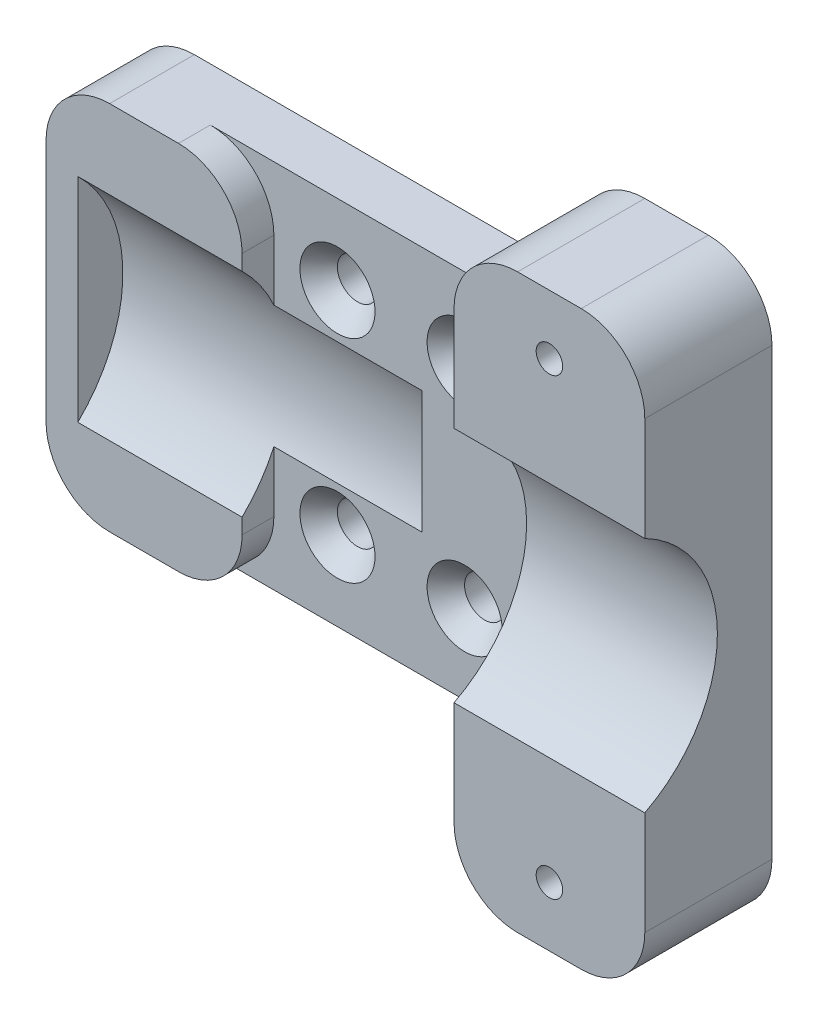
ISO-10303-21;
HEADER;
FILE_DESCRIPTION(('STEP AP214'),'2;1');
FILE_NAME('part.step','',(''),(''),'','','');
FILE_SCHEMA(('AUTOMOTIVE_DESIGN { 1 0 10303 214 1 1 1 1 }'));
ENDSEC;
DATA;
#1=APPLICATION_CONTEXT('core data for automotive mechanical design processes');
#2=APPLICATION_PROTOCOL_DEFINITION('international standard','automotive_design',2000,#1);
#3=PRODUCT_CONTEXT('',#1,'mechanical');
#4=PRODUCT('Part','Part','',(#3));
#5=PRODUCT_RELATED_PRODUCT_CATEGORY('part','',(#4));
#6=PRODUCT_DEFINITION_FORMATION('','',#4);
#7=PRODUCT_DEFINITION_CONTEXT('part definition',#1,'design');
#8=PRODUCT_DEFINITION('design','',#6,#7);
#9=PRODUCT_DEFINITION_SHAPE('','',#8);
#10=(LENGTH_UNIT() NAMED_UNIT(*) SI_UNIT(.MILLI.,.METRE.));
#11=(NAMED_UNIT(*) PLANE_ANGLE_UNIT() SI_UNIT($,.RADIAN.));
#12=(NAMED_UNIT(*) SI_UNIT($,.STERADIAN.) SOLID_ANGLE_UNIT());
#13=UNCERTAINTY_MEASURE_WITH_UNIT(LENGTH_MEASURE(1.E-05),#10,'distance_accuracy_value','');
#14=(GEOMETRIC_REPRESENTATION_CONTEXT(3) GLOBAL_UNCERTAINTY_ASSIGNED_CONTEXT((#13)) GLOBAL_UNIT_ASSIGNED_CONTEXT((#10,
#11,#12)) REPRESENTATION_CONTEXT('',''));
#15=CARTESIAN_POINT('',(0.,0.,0.));
#16=DIRECTION('',(0.,0.,1.));
#17=DIRECTION('',(1.,0.,0.));
#18=AXIS2_PLACEMENT_3D('',#15,#16,#17);
#19=CARTESIAN_POINT('',(-12.,17.5,12.));
#20=DIRECTION('',(-1.,0.,0.));
#21=DIRECTION('',(0.,0.,1.));
#22=AXIS2_PLACEMENT_3D('',#19,#20,#21);
#23=PLANE('',#22);
#24=DIRECTION('',(0.,1.,0.));
#25=VECTOR('',#24,1.);
#26=CARTESIAN_POINT('',(-12.,0.,5.));
#27=LINE('',#26,#25);
#28=CARTESIAN_POINT('',(-12.,5.78251675311019,5.));
#29=VERTEX_POINT('',#28);
#30=CARTESIAN_POINT('',(-12.,11.5,5.));
#31=VERTEX_POINT('',#30);
#32=EDGE_CURVE('E310',#29,#31,#27,.T.);
#33=ORIENTED_EDGE('',*,*,#32,.T.);
#34=DIRECTION('',(0.,0.,-1.));
#35=VECTOR('',#34,1.);
#36=CARTESIAN_POINT('',(-12.,11.5,12.));
#37=LINE('',#36,#35);
#38=CARTESIAN_POINT('',(-12.,11.5,8.));
#39=VERTEX_POINT('',#38);
#40=EDGE_CURVE('E394',#31,#39,#37,.F.);
#41=ORIENTED_EDGE('',*,*,#40,.T.);
#42=DIRECTION('',(0.,1.,0.));
#43=VECTOR('',#42,1.);
#44=CARTESIAN_POINT('',(-12.,17.5,8.));
#45=LINE('',#44,#43);
#46=CARTESIAN_POINT('',(-12.,10.0467656487051,8.));
#47=VERTEX_POINT('',#46);
#48=EDGE_CURVE('E306',#47,#39,#45,.T.);
#49=ORIENTED_EDGE('',*,*,#48,.F.);
#50=CARTESIAN_POINT('',(-12.,0.,17.75));
#51=DIRECTION('',(-1.,0.,0.));
#52=DIRECTION('',(0.,0.,1.));
#53=AXIS2_PLACEMENT_3D('',#50,#51,#52);
#54=CIRCLE('',#53,14.);
#55=EDGE_CURVE('E250',#47,#29,#54,.T.);
#56=ORIENTED_EDGE('',*,*,#55,.T.);
#57=EDGE_LOOP('',(#33,#41,#49,#56));
#58=FACE_BOUND('',#57,.T.);
#59=ADVANCED_FACE('F39',(#58),#23,.F.);
#60=CARTESIAN_POINT('',(0.,0.,12.));
#61=DIRECTION('',(0.,0.,1.));
#62=DIRECTION('',(1.,0.,0.));
#63=AXIS2_PLACEMENT_3D('',#60,#61,#62);
#64=PLANE('',#63);
#65=CARTESIAN_POINT('',(21.,-21.4,12.));
#66=DIRECTION('',(0.,0.,1.));
#67=DIRECTION('',(1.,0.,0.));
#68=AXIS2_PLACEMENT_3D('',#65,#66,#67);
#69=CIRCLE('',#68,1.25);
#70=CARTESIAN_POINT('',(22.25,-21.4,12.));
#71=VERTEX_POINT('',#70);
#72=EDGE_CURVE('E579',#71,#71,#69,.T.);
#73=ORIENTED_EDGE('',*,*,#72,.F.);
#74=EDGE_LOOP('',(#73));
#75=FACE_BOUND('',#74,.T.);
#76=DIRECTION('',(0.,-1.,0.));
#77=VECTOR('',#76,1.);
#78=CARTESIAN_POINT('',(12.,27.,12.));
#79=LINE('',#78,#77);
#80=CARTESIAN_POINT('',(12.,-11.2114896423267,12.));
#81=VERTEX_POINT('',#80);
#82=CARTESIAN_POINT('',(12.,-21.,12.));
#83=VERTEX_POINT('',#82);
#84=EDGE_CURVE('E223',#81,#83,#79,.T.);
#85=ORIENTED_EDGE('',*,*,#84,.T.);
#86=CARTESIAN_POINT('',(18.,-21.,12.));
#87=DIRECTION('',(0.,0.,1.));
#88=DIRECTION('',(1.,0.,0.));
#89=AXIS2_PLACEMENT_3D('',#86,#87,#88);
#90=CIRCLE('',#89,6.);
#91=CARTESIAN_POINT('',(18.,-27.,12.));
#92=VERTEX_POINT('',#91);
#93=EDGE_CURVE('E374',#83,#92,#90,.T.);
#94=ORIENTED_EDGE('',*,*,#93,.T.);
#95=DIRECTION('',(1.,0.,0.));
#96=VECTOR('',#95,1.);
#97=CARTESIAN_POINT('',(12.,-27.,12.));
#98=LINE('',#97,#96);
#99=CARTESIAN_POINT('',(24.,-27.,12.));
#100=VERTEX_POINT('',#99);
#101=EDGE_CURVE('E222',#92,#100,#98,.T.);
#102=ORIENTED_EDGE('',*,*,#101,.T.);
#103=CARTESIAN_POINT('',(24.,-21.,12.));
#104=DIRECTION('',(0.,0.,1.));
#105=DIRECTION('',(1.,0.,0.));
#106=AXIS2_PLACEMENT_3D('',#103,#104,#105);
#107=CIRCLE('',#106,6.);
#108=CARTESIAN_POINT('',(30.,-21.,12.));
#109=VERTEX_POINT('',#108);
#110=EDGE_CURVE('E372',#100,#109,#107,.T.);
#111=ORIENTED_EDGE('',*,*,#110,.T.);
#112=DIRECTION('',(0.,1.,0.));
#113=VECTOR('',#112,1.);
#114=CARTESIAN_POINT('',(30.,27.,12.));
#115=LINE('',#114,#113);
#116=CARTESIAN_POINT('',(30.,-11.2114896423267,12.));
#117=VERTEX_POINT('',#116);
#118=EDGE_CURVE('E296',#109,#117,#115,.T.);
#119=ORIENTED_EDGE('',*,*,#118,.T.);
#120=DIRECTION('',(1.,0.,0.));
#121=VECTOR('',#120,1.);
#122=CARTESIAN_POINT('',(44.5,-11.2114896423268,12.));
#123=LINE('',#122,#121);
#124=EDGE_CURVE('E232',#81,#117,#123,.T.);
#125=ORIENTED_EDGE('',*,*,#124,.F.);
#126=EDGE_LOOP('',(#85,#94,#102,#111,#119,#125));
#127=FACE_BOUND('',#126,.T.);
#128=ADVANCED_FACE('F468',(#75,#127),#64,.T.);
#129=CARTESIAN_POINT('',(0.,0.,5.));
#130=DIRECTION('',(0.,0.,-1.));
#131=DIRECTION('',(-1.,0.,0.));
#132=AXIS2_PLACEMENT_3D('',#129,#130,#131);
#133=PLANE('',#132);
#134=ORIENTED_EDGE('',*,*,#32,.F.);
#135=DIRECTION('',(1.,0.,0.));
#136=VECTOR('',#135,1.);
#137=CARTESIAN_POINT('',(44.5,5.78251675311022,5.));
#138=LINE('',#137,#136);
#139=CARTESIAN_POINT('',(2.,5.78251675311019,5.));
#140=VERTEX_POINT('',#139);
#141=EDGE_CURVE('E253',#29,#140,#138,.T.);
#142=ORIENTED_EDGE('',*,*,#141,.T.);
#143=DIRECTION('',(0.,-1.,0.));
#144=VECTOR('',#143,1.);
#145=CARTESIAN_POINT('',(2.,0.,5.));
#146=LINE('',#145,#144);
#147=CARTESIAN_POINT('',(2.,-5.78251675311019,5.));
#148=VERTEX_POINT('',#147);
#149=EDGE_CURVE('E326',#140,#148,#146,.T.);
#150=ORIENTED_EDGE('',*,*,#149,.T.);
#151=DIRECTION('',(1.,0.,0.));
#152=VECTOR('',#151,1.);
#153=CARTESIAN_POINT('',(44.5,-5.78251675311022,5.));
#154=LINE('',#153,#152);
#155=CARTESIAN_POINT('',(-12.,-5.78251675311019,5.));
#156=VERTEX_POINT('',#155);
#157=EDGE_CURVE('E249',#148,#156,#154,.F.);
#158=ORIENTED_EDGE('',*,*,#157,.T.);
#159=CARTESIAN_POINT('',(-12.,-11.5,5.));
#160=VERTEX_POINT('',#159);
#161=EDGE_CURVE('E307',#160,#156,#27,.T.);
#162=ORIENTED_EDGE('',*,*,#161,.F.);
#163=CARTESIAN_POINT('',(-18.,-11.5,5.));
#164=DIRECTION('',(0.,0.,-1.));
#165=DIRECTION('',(-1.,0.,0.));
#166=AXIS2_PLACEMENT_3D('',#163,#164,#165);
#167=CIRCLE('',#166,6.);
#168=CARTESIAN_POINT('',(-18.,-17.5,5.));
#169=VERTEX_POINT('',#168);
#170=EDGE_CURVE('E419',#160,#169,#167,.T.);
#171=ORIENTED_EDGE('',*,*,#170,.T.);
#172=DIRECTION('',(1.,0.,0.));
#173=VECTOR('',#172,1.);
#174=CARTESIAN_POINT('',(-30.5,-17.5,5.));
#175=LINE('',#174,#173);
#176=CARTESIAN_POINT('',(6.2633054056945,-17.5,5.));
#177=VERTEX_POINT('',#176);
#178=EDGE_CURVE('E233',#169,#177,#175,.T.);
#179=ORIENTED_EDGE('',*,*,#178,.T.);
#180=CARTESIAN_POINT('',(6.2633054056945,-23.5,5.));
#181=DIRECTION('',(0.,0.,-1.));
#182=DIRECTION('',(-1.,0.,0.));
#183=AXIS2_PLACEMENT_3D('',#180,#181,#182);
#184=CIRCLE('',#183,6.);
#185=CARTESIAN_POINT('',(12.1316527028473,-22.25,5.));
#186=VERTEX_POINT('',#185);
#187=EDGE_CURVE('E12',#177,#186,#184,.T.);
#188=ORIENTED_EDGE('',*,*,#187,.T.);
#189=CARTESIAN_POINT('',(18.,-21.,5.));
#190=DIRECTION('',(0.,0.,-1.));
#191=DIRECTION('',(-1.,0.,0.));
#192=AXIS2_PLACEMENT_3D('',#189,#190,#191);
#193=CIRCLE('',#192,6.);
#194=CARTESIAN_POINT('',(12.,-21.,5.));
#195=VERTEX_POINT('',#194);
#196=EDGE_CURVE('E430',#195,#186,#193,.F.);
#197=ORIENTED_EDGE('',*,*,#196,.F.);
#198=DIRECTION('',(0.,-1.,0.));
#199=VECTOR('',#198,1.);
#200=CARTESIAN_POINT('',(12.,0.,5.));
#201=LINE('',#200,#199);
#202=CARTESIAN_POINT('',(12.,21.,5.));
#203=VERTEX_POINT('',#202);
#204=EDGE_CURVE('E54',#203,#195,#201,.T.);
#205=ORIENTED_EDGE('',*,*,#204,.F.);
#206=CARTESIAN_POINT('',(18.,21.,5.));
#207=DIRECTION('',(0.,0.,-1.));
#208=DIRECTION('',(-1.,0.,0.));
#209=AXIS2_PLACEMENT_3D('',#206,#207,#208);
#210=CIRCLE('',#209,6.);
#211=CARTESIAN_POINT('',(12.1316527028473,22.25,5.));
#212=VERTEX_POINT('',#211);
#213=EDGE_CURVE('E422',#212,#203,#210,.F.);
#214=ORIENTED_EDGE('',*,*,#213,.F.);
#215=CARTESIAN_POINT('',(6.2633054056945,23.5,5.));
#216=DIRECTION('',(0.,0.,-1.));
#217=DIRECTION('',(-1.,0.,0.));
#218=AXIS2_PLACEMENT_3D('',#215,#216,#217);
#219=CIRCLE('',#218,6.);
#220=CARTESIAN_POINT('',(6.2633054056945,17.5,5.));
#221=VERTEX_POINT('',#220);
#222=EDGE_CURVE('E438',#212,#221,#219,.T.);
#223=ORIENTED_EDGE('',*,*,#222,.T.);
#224=DIRECTION('',(-1.,0.,0.));
#225=VECTOR('',#224,1.);
#226=CARTESIAN_POINT('',(-30.5,17.5,5.));
#227=LINE('',#226,#225);
#228=CARTESIAN_POINT('',(-18.,17.5,5.));
#229=VERTEX_POINT('',#228);
#230=EDGE_CURVE('E311',#221,#229,#227,.T.);
#231=ORIENTED_EDGE('',*,*,#230,.T.);
#232=CARTESIAN_POINT('',(-18.,11.5,5.));
#233=DIRECTION('',(0.,0.,-1.));
#234=DIRECTION('',(-1.,0.,0.));
#235=AXIS2_PLACEMENT_3D('',#232,#233,#234);
#236=CIRCLE('',#235,6.);
#237=EDGE_CURVE('E417',#229,#31,#236,.T.);
#238=ORIENTED_EDGE('',*,*,#237,.T.);
#239=EDGE_LOOP('',(#134,#142,#150,#158,#162,#171,#179,#188,#197,#205,#214,#223,#231,#238));
#240=FACE_BOUND('',#239,.T.);
#241=CARTESIAN_POINT('',(-6.,10.,5.));
#242=DIRECTION('',(0.,0.,1.));
#243=DIRECTION('',(1.,0.,0.));
#244=AXIS2_PLACEMENT_3D('',#241,#242,#243);
#245=CIRCLE('',#244,3.5433);
#246=CARTESIAN_POINT('',(-2.4567,10.,5.));
#247=VERTEX_POINT('',#246);
#248=EDGE_CURVE('E256',#247,#247,#245,.T.);
#249=ORIENTED_EDGE('',*,*,#248,.F.);
#250=EDGE_LOOP('',(#249));
#251=FACE_BOUND('',#250,.T.);
#252=CARTESIAN_POINT('',(6.,10.,5.));
#253=DIRECTION('',(0.,0.,1.));
#254=DIRECTION('',(1.,0.,0.));
#255=AXIS2_PLACEMENT_3D('',#252,#253,#254);
#256=CIRCLE('',#255,3.5433);
#257=CARTESIAN_POINT('',(9.5433,10.,5.));
#258=VERTEX_POINT('',#257);
#259=EDGE_CURVE('E265',#258,#258,#256,.T.);
#260=ORIENTED_EDGE('',*,*,#259,.F.);
#261=EDGE_LOOP('',(#260));
#262=FACE_BOUND('',#261,.T.);
#263=CARTESIAN_POINT('',(-6.,-10.,5.));
#264=DIRECTION('',(0.,0.,1.));
#265=DIRECTION('',(1.,0.,0.));
#266=AXIS2_PLACEMENT_3D('',#263,#264,#265);
#267=CIRCLE('',#266,3.5433);
#268=CARTESIAN_POINT('',(-2.4567,-10.,5.));
#269=VERTEX_POINT('',#268);
#270=EDGE_CURVE('E274',#269,#269,#267,.T.);
#271=ORIENTED_EDGE('',*,*,#270,.F.);
#272=EDGE_LOOP('',(#271));
#273=FACE_BOUND('',#272,.T.);
#274=CARTESIAN_POINT('',(6.,-10.,5.));
#275=DIRECTION('',(0.,0.,1.));
#276=DIRECTION('',(1.,0.,0.));
#277=AXIS2_PLACEMENT_3D('',#274,#275,#276);
#278=CIRCLE('',#277,3.5433);
#279=CARTESIAN_POINT('',(9.5433,-10.,5.));
#280=VERTEX_POINT('',#279);
#281=EDGE_CURVE('E283',#280,#280,#278,.T.);
#282=ORIENTED_EDGE('',*,*,#281,.F.);
#283=EDGE_LOOP('',(#282));
#284=FACE_BOUND('',#283,.T.);
#285=ADVANCED_FACE('F458',(#240,#251,#262,#273,#284),#133,.F.);
#286=CARTESIAN_POINT('',(-30.5,17.5,5.));
#287=DIRECTION('',(0.,-1.,0.));
#288=DIRECTION('',(0.,0.,-1.));
#289=AXIS2_PLACEMENT_3D('',#286,#287,#288);
#290=PLANE('',#289);
#291=ORIENTED_EDGE('',*,*,#230,.F.);
#292=DIRECTION('',(0.,0.,-1.));
#293=VECTOR('',#292,1.);
#294=CARTESIAN_POINT('',(6.2633054056945,17.5,5.));
#295=LINE('',#294,#293);
#296=CARTESIAN_POINT('',(6.2633054056945,17.5,0.));
#297=VERTEX_POINT('',#296);
#298=EDGE_CURVE('E428',#221,#297,#295,.T.);
#299=ORIENTED_EDGE('',*,*,#298,.T.);
#300=DIRECTION('',(-1.,0.,0.));
#301=VECTOR('',#300,1.);
#302=CARTESIAN_POINT('',(-30.5,17.5,0.));
#303=LINE('',#302,#301);
#304=CARTESIAN_POINT('',(-24.5,17.5,0.));
#305=VERTEX_POINT('',#304);
#306=EDGE_CURVE('E318',#297,#305,#303,.T.);
#307=ORIENTED_EDGE('',*,*,#306,.T.);
#308=DIRECTION('',(0.,0.,-1.));
#309=VECTOR('',#308,1.);
#310=CARTESIAN_POINT('',(-24.5,17.5,5.));
#311=LINE('',#310,#309);
#312=CARTESIAN_POINT('',(-24.5,17.5,8.));
#313=VERTEX_POINT('',#312);
#314=EDGE_CURVE('E389',#305,#313,#311,.F.);
#315=ORIENTED_EDGE('',*,*,#314,.T.);
#316=DIRECTION('',(-1.,0.,0.));
#317=VECTOR('',#316,1.);
#318=CARTESIAN_POINT('',(-12.,17.5,8.));
#319=LINE('',#318,#317);
#320=CARTESIAN_POINT('',(-18.,17.5,8.));
#321=VERTEX_POINT('',#320);
#322=EDGE_CURVE('E338',#321,#313,#319,.T.);
#323=ORIENTED_EDGE('',*,*,#322,.F.);
#324=DIRECTION('',(0.,0.,-1.));
#325=VECTOR('',#324,1.);
#326=CARTESIAN_POINT('',(-18.,17.5,5.));
#327=LINE('',#326,#325);
#328=EDGE_CURVE('E391',#321,#229,#327,.T.);
#329=ORIENTED_EDGE('',*,*,#328,.T.);
#330=EDGE_LOOP('',(#291,#299,#307,#315,#323,#329));
#331=FACE_BOUND('',#330,.T.);
#332=ADVANCED_FACE('F519',(#331),#290,.F.);
#333=CARTESIAN_POINT('',(-30.5,-17.5,5.));
#334=DIRECTION('',(0.,1.,0.));
#335=DIRECTION('',(0.,0.,1.));
#336=AXIS2_PLACEMENT_3D('',#333,#334,#335);
#337=PLANE('',#336);
#338=DIRECTION('',(1.,0.,0.));
#339=VECTOR('',#338,1.);
#340=CARTESIAN_POINT('',(-30.5,-17.5,0.));
#341=LINE('',#340,#339);
#342=CARTESIAN_POINT('',(-24.5,-17.5,0.));
#343=VERTEX_POINT('',#342);
#344=CARTESIAN_POINT('',(6.2633054056945,-17.5,0.));
#345=VERTEX_POINT('',#344);
#346=EDGE_CURVE('E313',#343,#345,#341,.T.);
#347=ORIENTED_EDGE('',*,*,#346,.T.);
#348=DIRECTION('',(0.,0.,-1.));
#349=VECTOR('',#348,1.);
#350=CARTESIAN_POINT('',(6.2633054056945,-17.5,5.));
#351=LINE('',#350,#349);
#352=EDGE_CURVE('E436',#345,#177,#351,.F.);
#353=ORIENTED_EDGE('',*,*,#352,.T.);
#354=ORIENTED_EDGE('',*,*,#178,.F.);
#355=DIRECTION('',(0.,0.,-1.));
#356=VECTOR('',#355,1.);
#357=CARTESIAN_POINT('',(-18.,-17.5,5.));
#358=LINE('',#357,#356);
#359=CARTESIAN_POINT('',(-18.,-17.5,8.));
#360=VERTEX_POINT('',#359);
#361=EDGE_CURVE('E410',#169,#360,#358,.F.);
#362=ORIENTED_EDGE('',*,*,#361,.T.);
#363=DIRECTION('',(1.,0.,0.));
#364=VECTOR('',#363,1.);
#365=CARTESIAN_POINT('',(-12.,-17.5,8.));
#366=LINE('',#365,#364);
#367=CARTESIAN_POINT('',(-24.5,-17.5,8.));
#368=VERTEX_POINT('',#367);
#369=EDGE_CURVE('E339',#368,#360,#366,.T.);
#370=ORIENTED_EDGE('',*,*,#369,.F.);
#371=DIRECTION('',(0.,0.,-1.));
#372=VECTOR('',#371,1.);
#373=CARTESIAN_POINT('',(-24.5,-17.5,5.));
#374=LINE('',#373,#372);
#375=EDGE_CURVE('E407',#368,#343,#374,.T.);
#376=ORIENTED_EDGE('',*,*,#375,.T.);
#377=EDGE_LOOP('',(#347,#353,#354,#362,#370,#376));
#378=FACE_BOUND('',#377,.T.);
#379=ADVANCED_FACE('F492',(#378),#337,.F.);
#380=CARTESIAN_POINT('',(30.,-17.5,5.));
#381=DIRECTION('',(-1.,0.,0.));
#382=DIRECTION('',(0.,0.,1.));
#383=AXIS2_PLACEMENT_3D('',#380,#381,#382);
#384=PLANE('',#383);
#385=DIRECTION('',(0.,1.,0.));
#386=VECTOR('',#385,1.);
#387=CARTESIAN_POINT('',(30.,-17.5,0.));
#388=LINE('',#387,#386);
#389=CARTESIAN_POINT('',(30.,-21.,0.));
#390=VERTEX_POINT('',#389);
#391=CARTESIAN_POINT('',(30.,21.,0.));
#392=VERTEX_POINT('',#391);
#393=EDGE_CURVE('E309',#390,#392,#388,.T.);
#394=ORIENTED_EDGE('',*,*,#393,.T.);
#395=DIRECTION('',(0.,0.,-1.));
#396=VECTOR('',#395,1.);
#397=CARTESIAN_POINT('',(30.,21.,5.));
#398=LINE('',#397,#396);
#399=CARTESIAN_POINT('',(30.,21.,12.));
#400=VERTEX_POINT('',#399);
#401=EDGE_CURVE('E387',#392,#400,#398,.F.);
#402=ORIENTED_EDGE('',*,*,#401,.T.);
#403=CARTESIAN_POINT('',(30.,11.2114896423267,12.));
#404=VERTEX_POINT('',#403);
#405=EDGE_CURVE('E295',#404,#400,#115,.T.);
#406=ORIENTED_EDGE('',*,*,#405,.F.);
#407=CARTESIAN_POINT('',(30.,0.,17.75));
#408=DIRECTION('',(-1.,0.,0.));
#409=DIRECTION('',(0.,0.,1.));
#410=AXIS2_PLACEMENT_3D('',#407,#408,#409);
#411=CIRCLE('',#410,12.6);
#412=EDGE_CURVE('E231',#404,#117,#411,.T.);
#413=ORIENTED_EDGE('',*,*,#412,.T.);
#414=ORIENTED_EDGE('',*,*,#118,.F.);
#415=DIRECTION('',(0.,0.,-1.));
#416=VECTOR('',#415,1.);
#417=CARTESIAN_POINT('',(30.,-21.,5.));
#418=LINE('',#417,#416);
#419=EDGE_CURVE('E384',#109,#390,#418,.T.);
#420=ORIENTED_EDGE('',*,*,#419,.T.);
#421=EDGE_LOOP('',(#394,#402,#406,#413,#414,#420));
#422=FACE_BOUND('',#421,.T.);
#423=ADVANCED_FACE('F472',(#422),#384,.F.);
#424=CARTESIAN_POINT('',(-30.5,17.5,5.));
#425=DIRECTION('',(1.,0.,0.));
#426=DIRECTION('',(0.,1.,0.));
#427=AXIS2_PLACEMENT_3D('',#424,#425,#426);
#428=PLANE('',#427);
#429=DIRECTION('',(0.,-1.,0.));
#430=VECTOR('',#429,1.);
#431=CARTESIAN_POINT('',(-30.5,17.5,8.));
#432=LINE('',#431,#430);
#433=CARTESIAN_POINT('',(-30.5,11.5,8.));
#434=VERTEX_POINT('',#433);
#435=CARTESIAN_POINT('',(-30.5,-11.5,8.));
#436=VERTEX_POINT('',#435);
#437=EDGE_CURVE('E342',#434,#436,#432,.T.);
#438=ORIENTED_EDGE('',*,*,#437,.F.);
#439=DIRECTION('',(0.,0.,-1.));
#440=VECTOR('',#439,1.);
#441=CARTESIAN_POINT('',(-30.5,11.5,5.));
#442=LINE('',#441,#440);
#443=CARTESIAN_POINT('',(-30.5,11.5,0.));
#444=VERTEX_POINT('',#443);
#445=EDGE_CURVE('E414',#434,#444,#442,.T.);
#446=ORIENTED_EDGE('',*,*,#445,.T.);
#447=DIRECTION('',(0.,-1.,0.));
#448=VECTOR('',#447,1.);
#449=CARTESIAN_POINT('',(-30.5,17.5,0.));
#450=LINE('',#449,#448);
#451=CARTESIAN_POINT('',(-30.5,-11.5,0.));
#452=VERTEX_POINT('',#451);
#453=EDGE_CURVE('E320',#444,#452,#450,.T.);
#454=ORIENTED_EDGE('',*,*,#453,.T.);
#455=DIRECTION('',(0.,0.,-1.));
#456=VECTOR('',#455,1.);
#457=CARTESIAN_POINT('',(-30.5,-11.5,5.));
#458=LINE('',#457,#456);
#459=EDGE_CURVE('E412',#452,#436,#458,.F.);
#460=ORIENTED_EDGE('',*,*,#459,.T.);
#461=EDGE_LOOP('',(#438,#446,#454,#460));
#462=FACE_BOUND('',#461,.T.);
#463=ADVANCED_FACE('F511',(#462),#428,.F.);
#464=CARTESIAN_POINT('',(0.,0.,0.));
#465=DIRECTION('',(0.,0.,-1.));
#466=DIRECTION('',(-1.,0.,0.));
#467=AXIS2_PLACEMENT_3D('',#464,#465,#466);
#468=PLANE('',#467);
#469=CARTESIAN_POINT('',(21.,21.4,0.));
#470=DIRECTION('',(0.,0.,-1.));
#471=DIRECTION('',(-1.,0.,0.));
#472=AXIS2_PLACEMENT_3D('',#469,#470,#471);
#473=CIRCLE('',#472,1.25);
#474=CARTESIAN_POINT('',(19.75,21.4,0.));
#475=VERTEX_POINT('',#474);
#476=EDGE_CURVE('E576',#475,#475,#473,.T.);
#477=ORIENTED_EDGE('',*,*,#476,.F.);
#478=EDGE_LOOP('',(#477));
#479=FACE_BOUND('',#478,.T.);
#480=CARTESIAN_POINT('',(21.,-21.4,0.));
#481=DIRECTION('',(0.,0.,-1.));
#482=DIRECTION('',(-1.,0.,0.));
#483=AXIS2_PLACEMENT_3D('',#480,#481,#482);
#484=CIRCLE('',#483,1.25);
#485=CARTESIAN_POINT('',(19.75,-21.4,0.));
#486=VERTEX_POINT('',#485);
#487=EDGE_CURVE('E584',#486,#486,#484,.T.);
#488=ORIENTED_EDGE('',*,*,#487,.F.);
#489=EDGE_LOOP('',(#488));
#490=FACE_BOUND('',#489,.T.);
#491=CARTESIAN_POINT('',(-6.,10.,0.));
#492=DIRECTION('',(0.,0.,1.));
#493=DIRECTION('',(1.,0.,0.));
#494=AXIS2_PLACEMENT_3D('',#491,#492,#493);
#495=CIRCLE('',#494,1.89865);
#496=CARTESIAN_POINT('',(-4.10135,10.,0.));
#497=VERTEX_POINT('',#496);
#498=EDGE_CURVE('E262',#497,#497,#495,.T.);
#499=ORIENTED_EDGE('',*,*,#498,.T.);
#500=EDGE_LOOP('',(#499));
#501=FACE_BOUND('',#500,.T.);
#502=CARTESIAN_POINT('',(6.,10.,0.));
#503=DIRECTION('',(0.,0.,1.));
#504=DIRECTION('',(1.,0.,0.));
#505=AXIS2_PLACEMENT_3D('',#502,#503,#504);
#506=CIRCLE('',#505,1.89865);
#507=CARTESIAN_POINT('',(7.89864999999999,10.,0.));
#508=VERTEX_POINT('',#507);
#509=EDGE_CURVE('E271',#508,#508,#506,.T.);
#510=ORIENTED_EDGE('',*,*,#509,.T.);
#511=EDGE_LOOP('',(#510));
#512=FACE_BOUND('',#511,.T.);
#513=CARTESIAN_POINT('',(-6.,-10.,0.));
#514=DIRECTION('',(0.,0.,1.));
#515=DIRECTION('',(1.,0.,0.));
#516=AXIS2_PLACEMENT_3D('',#513,#514,#515);
#517=CIRCLE('',#516,1.89865);
#518=CARTESIAN_POINT('',(-4.10135,-10.,0.));
#519=VERTEX_POINT('',#518);
#520=EDGE_CURVE('E280',#519,#519,#517,.T.);
#521=ORIENTED_EDGE('',*,*,#520,.T.);
#522=EDGE_LOOP('',(#521));
#523=FACE_BOUND('',#522,.T.);
#524=CARTESIAN_POINT('',(6.,-10.,0.));
#525=DIRECTION('',(0.,0.,1.));
#526=DIRECTION('',(1.,0.,0.));
#527=AXIS2_PLACEMENT_3D('',#524,#525,#526);
#528=CIRCLE('',#527,1.89865);
#529=CARTESIAN_POINT('',(7.89864999999999,-10.,0.));
#530=VERTEX_POINT('',#529);
#531=EDGE_CURVE('E289',#530,#530,#528,.T.);
#532=ORIENTED_EDGE('',*,*,#531,.T.);
#533=EDGE_LOOP('',(#532));
#534=FACE_BOUND('',#533,.T.);
#535=DIRECTION('',(1.,0.,0.));
#536=VECTOR('',#535,1.);
#537=CARTESIAN_POINT('',(12.,-27.,0.));
#538=LINE('',#537,#536);
#539=CARTESIAN_POINT('',(18.,-27.,0.));
#540=VERTEX_POINT('',#539);
#541=CARTESIAN_POINT('',(24.,-27.,0.));
#542=VERTEX_POINT('',#541);
#543=EDGE_CURVE('E291',#540,#542,#538,.T.);
#544=ORIENTED_EDGE('',*,*,#543,.F.);
#545=CARTESIAN_POINT('',(18.,-21.,0.));
#546=DIRECTION('',(0.,0.,-1.));
#547=DIRECTION('',(-1.,0.,0.));
#548=AXIS2_PLACEMENT_3D('',#545,#546,#547);
#549=CIRCLE('',#548,6.);
#550=CARTESIAN_POINT('',(12.1316527028473,-22.25,0.));
#551=VERTEX_POINT('',#550);
#552=EDGE_CURVE('E366',#540,#551,#549,.T.);
#553=ORIENTED_EDGE('',*,*,#552,.T.);
#554=CARTESIAN_POINT('',(6.2633054056945,-23.5,0.));
#555=DIRECTION('',(0.,0.,-1.));
#556=DIRECTION('',(-1.,0.,0.));
#557=AXIS2_PLACEMENT_3D('',#554,#555,#556);
#558=CIRCLE('',#557,6.);
#559=EDGE_CURVE('E47',#551,#345,#558,.F.);
#560=ORIENTED_EDGE('',*,*,#559,.T.);
#561=ORIENTED_EDGE('',*,*,#346,.F.);
#562=CARTESIAN_POINT('',(-24.5,-11.5,0.));
#563=DIRECTION('',(0.,0.,-1.));
#564=DIRECTION('',(-1.,0.,0.));
#565=AXIS2_PLACEMENT_3D('',#562,#563,#564);
#566=CIRCLE('',#565,6.);
#567=EDGE_CURVE('E355',#343,#452,#566,.T.);
#568=ORIENTED_EDGE('',*,*,#567,.T.);
#569=ORIENTED_EDGE('',*,*,#453,.F.);
#570=CARTESIAN_POINT('',(-24.5,11.5,0.));
#571=DIRECTION('',(0.,0.,-1.));
#572=DIRECTION('',(-1.,0.,0.));
#573=AXIS2_PLACEMENT_3D('',#570,#571,#572);
#574=CIRCLE('',#573,6.);
#575=EDGE_CURVE('E357',#444,#305,#574,.T.);
#576=ORIENTED_EDGE('',*,*,#575,.T.);
#577=ORIENTED_EDGE('',*,*,#306,.F.);
#578=CARTESIAN_POINT('',(6.2633054056945,23.5,0.));
#579=DIRECTION('',(0.,0.,-1.));
#580=DIRECTION('',(-1.,0.,0.));
#581=AXIS2_PLACEMENT_3D('',#578,#579,#580);
#582=CIRCLE('',#581,6.);
#583=CARTESIAN_POINT('',(12.1316527028473,22.25,0.));
#584=VERTEX_POINT('',#583);
#585=EDGE_CURVE('E440',#297,#584,#582,.F.);
#586=ORIENTED_EDGE('',*,*,#585,.T.);
#587=CARTESIAN_POINT('',(18.,21.,0.));
#588=DIRECTION('',(0.,0.,-1.));
#589=DIRECTION('',(-1.,0.,0.));
#590=AXIS2_PLACEMENT_3D('',#587,#588,#589);
#591=CIRCLE('',#590,6.);
#592=CARTESIAN_POINT('',(18.,27.,0.));
#593=VERTEX_POINT('',#592);
#594=EDGE_CURVE('E364',#584,#593,#591,.T.);
#595=ORIENTED_EDGE('',*,*,#594,.T.);
#596=DIRECTION('',(-1.,0.,0.));
#597=VECTOR('',#596,1.);
#598=CARTESIAN_POINT('',(12.,27.,0.));
#599=LINE('',#598,#597);
#600=CARTESIAN_POINT('',(24.,27.,0.));
#601=VERTEX_POINT('',#600);
#602=EDGE_CURVE('E302',#601,#593,#599,.T.);
#603=ORIENTED_EDGE('',*,*,#602,.F.);
#604=CARTESIAN_POINT('',(24.,21.,0.));
#605=DIRECTION('',(0.,0.,-1.));
#606=DIRECTION('',(-1.,0.,0.));
#607=AXIS2_PLACEMENT_3D('',#604,#605,#606);
#608=CIRCLE('',#607,6.);
#609=EDGE_CURVE('E362',#601,#392,#608,.T.);
#610=ORIENTED_EDGE('',*,*,#609,.T.);
#611=ORIENTED_EDGE('',*,*,#393,.F.);
#612=CARTESIAN_POINT('',(24.,-21.,0.));
#613=DIRECTION('',(0.,0.,-1.));
#614=DIRECTION('',(-1.,0.,0.));
#615=AXIS2_PLACEMENT_3D('',#612,#613,#614);
#616=CIRCLE('',#615,6.);
#617=EDGE_CURVE('E360',#390,#542,#616,.T.);
#618=ORIENTED_EDGE('',*,*,#617,.T.);
#619=EDGE_LOOP('',(#544,#553,#560,#561,#568,#569,#576,#577,#586,#595,#603,#610,#611,#618));
#620=FACE_BOUND('',#619,.T.);
#621=ADVANCED_FACE('F445',(#479,#490,#501,#512,#523,#534,#620),#468,.T.);
#622=DIRECTION('',(0.,1.,0.));
#623=VECTOR('',#622,1.);
#624=CARTESIAN_POINT('',(-12.,17.5,8.));
#625=LINE('',#624,#623);
#626=CARTESIAN_POINT('',(-12.,-11.5,8.));
#627=VERTEX_POINT('',#626);
#628=CARTESIAN_POINT('',(-12.,-10.0467656487051,8.));
#629=VERTEX_POINT('',#628);
#630=EDGE_CURVE('E336',#627,#629,#625,.T.);
#631=ORIENTED_EDGE('',*,*,#630,.F.);
#632=DIRECTION('',(0.,0.,-1.));
#633=VECTOR('',#632,1.);
#634=CARTESIAN_POINT('',(-12.,-11.5,12.));
#635=LINE('',#634,#633);
#636=EDGE_CURVE('E404',#627,#160,#635,.T.);
#637=ORIENTED_EDGE('',*,*,#636,.T.);
#638=ORIENTED_EDGE('',*,*,#161,.T.);
#639=EDGE_CURVE('E240',#156,#629,#54,.T.);
#640=ORIENTED_EDGE('',*,*,#639,.T.);
#641=EDGE_LOOP('',(#631,#637,#638,#640));
#642=FACE_BOUND('',#641,.T.);
#643=ADVANCED_FACE('F539',(#642),#23,.F.);
#644=CARTESIAN_POINT('',(0.,0.,8.));
#645=DIRECTION('',(0.,0.,-1.));
#646=DIRECTION('',(-1.,0.,0.));
#647=AXIS2_PLACEMENT_3D('',#644,#645,#646);
#648=PLANE('',#647);
#649=ORIENTED_EDGE('',*,*,#48,.T.);
#650=CARTESIAN_POINT('',(-18.,11.5,8.));
#651=DIRECTION('',(0.,0.,-1.));
#652=DIRECTION('',(-1.,0.,0.));
#653=AXIS2_PLACEMENT_3D('',#650,#651,#652);
#654=CIRCLE('',#653,6.);
#655=EDGE_CURVE('E402',#39,#321,#654,.F.);
#656=ORIENTED_EDGE('',*,*,#655,.T.);
#657=ORIENTED_EDGE('',*,*,#322,.T.);
#658=CARTESIAN_POINT('',(-24.5,11.5,8.));
#659=DIRECTION('',(0.,0.,-1.));
#660=DIRECTION('',(-1.,0.,0.));
#661=AXIS2_PLACEMENT_3D('',#658,#659,#660);
#662=CIRCLE('',#661,6.);
#663=EDGE_CURVE('E398',#313,#434,#662,.F.);
#664=ORIENTED_EDGE('',*,*,#663,.T.);
#665=ORIENTED_EDGE('',*,*,#437,.T.);
#666=CARTESIAN_POINT('',(-24.5,-11.5,8.));
#667=DIRECTION('',(0.,0.,-1.));
#668=DIRECTION('',(-1.,0.,0.));
#669=AXIS2_PLACEMENT_3D('',#666,#667,#668);
#670=CIRCLE('',#669,6.);
#671=EDGE_CURVE('E396',#436,#368,#670,.F.);
#672=ORIENTED_EDGE('',*,*,#671,.T.);
#673=ORIENTED_EDGE('',*,*,#369,.T.);
#674=CARTESIAN_POINT('',(-18.,-11.5,8.));
#675=DIRECTION('',(0.,0.,-1.));
#676=DIRECTION('',(-1.,0.,0.));
#677=AXIS2_PLACEMENT_3D('',#674,#675,#676);
#678=CIRCLE('',#677,6.);
#679=EDGE_CURVE('E400',#360,#627,#678,.F.);
#680=ORIENTED_EDGE('',*,*,#679,.T.);
#681=ORIENTED_EDGE('',*,*,#630,.T.);
#682=DIRECTION('',(1.,0.,0.));
#683=VECTOR('',#682,1.);
#684=CARTESIAN_POINT('',(-12.,-10.0467656487051,8.));
#685=LINE('',#684,#683);
#686=CARTESIAN_POINT('',(-27.5,-10.0467656487051,8.));
#687=VERTEX_POINT('',#686);
#688=EDGE_CURVE('E325',#629,#687,#685,.F.);
#689=ORIENTED_EDGE('',*,*,#688,.T.);
#690=DIRECTION('',(0.,1.,0.));
#691=VECTOR('',#690,1.);
#692=CARTESIAN_POINT('',(-27.5,0.,8.));
#693=LINE('',#692,#691);
#694=CARTESIAN_POINT('',(-27.5,10.0467656487051,8.));
#695=VERTEX_POINT('',#694);
#696=EDGE_CURVE('E331',#687,#695,#693,.T.);
#697=ORIENTED_EDGE('',*,*,#696,.T.);
#698=DIRECTION('',(1.,0.,0.));
#699=VECTOR('',#698,1.);
#700=CARTESIAN_POINT('',(-27.5,10.0467656487051,8.));
#701=LINE('',#700,#699);
#702=EDGE_CURVE('E330',#695,#47,#701,.T.);
#703=ORIENTED_EDGE('',*,*,#702,.T.);
#704=EDGE_LOOP('',(#649,#656,#657,#664,#665,#672,#673,#680,#681,#689,#697,#703));
#705=FACE_BOUND('',#704,.T.);
#706=ADVANCED_FACE('F502',(#705),#648,.F.);
#707=CARTESIAN_POINT('',(12.,27.,12.));
#708=DIRECTION('',(1.,0.,0.));
#709=DIRECTION('',(0.,1.,0.));
#710=AXIS2_PLACEMENT_3D('',#707,#708,#709);
#711=PLANE('',#710);
#712=DIRECTION('',(0.,0.,-1.));
#713=VECTOR('',#712,1.);
#714=CARTESIAN_POINT('',(12.,21.,12.));
#715=LINE('',#714,#713);
#716=CARTESIAN_POINT('',(12.,21.,12.));
#717=VERTEX_POINT('',#716);
#718=EDGE_CURVE('E368',#717,#203,#715,.T.);
#719=ORIENTED_EDGE('',*,*,#718,.T.);
#720=ORIENTED_EDGE('',*,*,#204,.T.);
#721=DIRECTION('',(0.,0.,-1.));
#722=VECTOR('',#721,1.);
#723=CARTESIAN_POINT('',(12.,-21.,12.));
#724=LINE('',#723,#722);
#725=EDGE_CURVE('E370',#195,#83,#724,.F.);
#726=ORIENTED_EDGE('',*,*,#725,.T.);
#727=ORIENTED_EDGE('',*,*,#84,.F.);
#728=CARTESIAN_POINT('',(12.,0.,17.75));
#729=DIRECTION('',(1.,0.,0.));
#730=DIRECTION('',(0.,1.,0.));
#731=AXIS2_PLACEMENT_3D('',#728,#729,#730);
#732=CIRCLE('',#731,12.6);
#733=CARTESIAN_POINT('',(12.,11.2114896423268,12.));
#734=VERTEX_POINT('',#733);
#735=EDGE_CURVE('E228',#81,#734,#732,.T.);
#736=ORIENTED_EDGE('',*,*,#735,.T.);
#737=EDGE_CURVE('E211',#717,#734,#79,.T.);
#738=ORIENTED_EDGE('',*,*,#737,.F.);
#739=EDGE_LOOP('',(#719,#720,#726,#727,#736,#738));
#740=FACE_BOUND('',#739,.T.);
#741=ADVANCED_FACE('F236',(#740),#711,.F.);
#742=CARTESIAN_POINT('',(12.,-27.,12.));
#743=DIRECTION('',(0.,1.,0.));
#744=DIRECTION('',(0.,0.,1.));
#745=AXIS2_PLACEMENT_3D('',#742,#743,#744);
#746=PLANE('',#745);
#747=ORIENTED_EDGE('',*,*,#101,.F.);
#748=DIRECTION('',(0.,0.,-1.));
#749=VECTOR('',#748,1.);
#750=CARTESIAN_POINT('',(18.,-27.,12.));
#751=LINE('',#750,#749);
#752=EDGE_CURVE('E352',#92,#540,#751,.T.);
#753=ORIENTED_EDGE('',*,*,#752,.T.);
#754=ORIENTED_EDGE('',*,*,#543,.T.);
#755=DIRECTION('',(0.,0.,-1.));
#756=VECTOR('',#755,1.);
#757=CARTESIAN_POINT('',(24.,-27.,12.));
#758=LINE('',#757,#756);
#759=EDGE_CURVE('E329',#542,#100,#758,.F.);
#760=ORIENTED_EDGE('',*,*,#759,.T.);
#761=EDGE_LOOP('',(#747,#753,#754,#760));
#762=FACE_BOUND('',#761,.T.);
#763=ADVANCED_FACE('F488',(#762),#746,.F.);
#764=CARTESIAN_POINT('',(12.,27.,12.));
#765=DIRECTION('',(0.,-1.,0.));
#766=DIRECTION('',(0.,0.,-1.));
#767=AXIS2_PLACEMENT_3D('',#764,#765,#766);
#768=PLANE('',#767);
#769=ORIENTED_EDGE('',*,*,#602,.T.);
#770=DIRECTION('',(0.,0.,-1.));
#771=VECTOR('',#770,1.);
#772=CARTESIAN_POINT('',(18.,27.,12.));
#773=LINE('',#772,#771);
#774=CARTESIAN_POINT('',(18.,27.,12.));
#775=VERTEX_POINT('',#774);
#776=EDGE_CURVE('E379',#593,#775,#773,.F.);
#777=ORIENTED_EDGE('',*,*,#776,.T.);
#778=DIRECTION('',(-1.,0.,0.));
#779=VECTOR('',#778,1.);
#780=CARTESIAN_POINT('',(12.,27.,12.));
#781=LINE('',#780,#779);
#782=CARTESIAN_POINT('',(24.,27.,12.));
#783=VERTEX_POINT('',#782);
#784=EDGE_CURVE('E298',#783,#775,#781,.T.);
#785=ORIENTED_EDGE('',*,*,#784,.F.);
#786=DIRECTION('',(0.,0.,-1.));
#787=VECTOR('',#786,1.);
#788=CARTESIAN_POINT('',(24.,27.,12.));
#789=LINE('',#788,#787);
#790=EDGE_CURVE('E376',#783,#601,#789,.T.);
#791=ORIENTED_EDGE('',*,*,#790,.T.);
#792=EDGE_LOOP('',(#769,#777,#785,#791));
#793=FACE_BOUND('',#792,.T.);
#794=ADVANCED_FACE('F481',(#793),#768,.F.);
#795=CARTESIAN_POINT('',(21.,21.4,12.));
#796=DIRECTION('',(0.,0.,1.));
#797=DIRECTION('',(1.,0.,0.));
#798=AXIS2_PLACEMENT_3D('',#795,#796,#797);
#799=CIRCLE('',#798,1.25);
#800=CARTESIAN_POINT('',(22.25,21.4,12.));
#801=VERTEX_POINT('',#800);
#802=EDGE_CURVE('E574',#801,#801,#799,.T.);
#803=ORIENTED_EDGE('',*,*,#802,.F.);
#804=EDGE_LOOP('',(#803));
#805=FACE_BOUND('',#804,.T.);
#806=ORIENTED_EDGE('',*,*,#784,.T.);
#807=CARTESIAN_POINT('',(18.,21.,12.));
#808=DIRECTION('',(0.,0.,1.));
#809=DIRECTION('',(1.,0.,0.));
#810=AXIS2_PLACEMENT_3D('',#807,#808,#809);
#811=CIRCLE('',#810,6.);
#812=EDGE_CURVE('E219',#775,#717,#811,.T.);
#813=ORIENTED_EDGE('',*,*,#812,.T.);
#814=ORIENTED_EDGE('',*,*,#737,.T.);
#815=DIRECTION('',(1.,0.,0.));
#816=VECTOR('',#815,1.);
#817=CARTESIAN_POINT('',(44.5,11.2114896423268,12.));
#818=LINE('',#817,#816);
#819=EDGE_CURVE('E216',#404,#734,#818,.F.);
#820=ORIENTED_EDGE('',*,*,#819,.F.);
#821=ORIENTED_EDGE('',*,*,#405,.T.);
#822=CARTESIAN_POINT('',(24.,21.,12.));
#823=DIRECTION('',(0.,0.,1.));
#824=DIRECTION('',(1.,0.,0.));
#825=AXIS2_PLACEMENT_3D('',#822,#823,#824);
#826=CIRCLE('',#825,6.);
#827=EDGE_CURVE('E381',#400,#783,#826,.T.);
#828=ORIENTED_EDGE('',*,*,#827,.T.);
#829=EDGE_LOOP('',(#806,#813,#814,#820,#821,#828));
#830=FACE_BOUND('',#829,.T.);
#831=ADVANCED_FACE('F214',(#805,#830),#64,.T.);
#832=CARTESIAN_POINT('',(6.,-10.,5.));
#833=DIRECTION('',(0.,0.,1.));
#834=DIRECTION('',(1.,0.,0.));
#835=AXIS2_PLACEMENT_3D('',#832,#833,#834);
#836=CYLINDRICAL_SURFACE('',#835,1.89865);
#837=ORIENTED_EDGE('',*,*,#531,.F.);
#838=EDGE_LOOP('',(#837));
#839=FACE_BOUND('',#838,.T.);
#840=CARTESIAN_POINT('',(6.,-10.,3.10804659906396));
#841=DIRECTION('',(0.,0.,1.));
#842=DIRECTION('',(1.,0.,0.));
#843=AXIS2_PLACEMENT_3D('',#840,#841,#842);
#844=CIRCLE('',#843,1.89864999999999);
#845=CARTESIAN_POINT('',(7.89864999999999,-10.,3.10804659906396));
#846=VERTEX_POINT('',#845);
#847=EDGE_CURVE('E286',#846,#846,#844,.T.);
#848=ORIENTED_EDGE('',*,*,#847,.T.);
#849=EDGE_LOOP('',(#848));
#850=FACE_BOUND('',#849,.T.);
#851=ADVANCED_FACE('F564',(#839,#850),#836,.F.);
#852=CARTESIAN_POINT('',(6.,-10.,5.));
#853=DIRECTION('',(0.,0.,1.));
#854=DIRECTION('',(1.,0.,0.));
#855=AXIS2_PLACEMENT_3D('',#852,#853,#854);
#856=CONICAL_SURFACE('',#855,3.5433,0.715584993317675);
#857=ORIENTED_EDGE('',*,*,#847,.F.);
#858=EDGE_LOOP('',(#857));
#859=FACE_BOUND('',#858,.T.);
#860=ORIENTED_EDGE('',*,*,#281,.T.);
#861=EDGE_LOOP('',(#860));
#862=FACE_BOUND('',#861,.T.);
#863=ADVANCED_FACE('F570',(#859,#862),#856,.F.);
#864=CARTESIAN_POINT('',(-6.,-10.,5.));
#865=DIRECTION('',(0.,0.,1.));
#866=DIRECTION('',(1.,0.,0.));
#867=AXIS2_PLACEMENT_3D('',#864,#865,#866);
#868=CYLINDRICAL_SURFACE('',#867,1.89865);
#869=ORIENTED_EDGE('',*,*,#520,.F.);
#870=EDGE_LOOP('',(#869));
#871=FACE_BOUND('',#870,.T.);
#872=CARTESIAN_POINT('',(-6.,-10.,3.10804659906396));
#873=DIRECTION('',(0.,0.,1.));
#874=DIRECTION('',(1.,0.,0.));
#875=AXIS2_PLACEMENT_3D('',#872,#873,#874);
#876=CIRCLE('',#875,1.89864999999999);
#877=CARTESIAN_POINT('',(-4.10135,-10.,3.10804659906396));
#878=VERTEX_POINT('',#877);
#879=EDGE_CURVE('E277',#878,#878,#876,.T.);
#880=ORIENTED_EDGE('',*,*,#879,.T.);
#881=EDGE_LOOP('',(#880));
#882=FACE_BOUND('',#881,.T.);
#883=ADVANCED_FACE('F621',(#871,#882),#868,.F.);
#884=CARTESIAN_POINT('',(-6.,-10.,5.));
#885=DIRECTION('',(0.,0.,1.));
#886=DIRECTION('',(1.,0.,0.));
#887=AXIS2_PLACEMENT_3D('',#884,#885,#886);
#888=CONICAL_SURFACE('',#887,3.5433,0.715584993317675);
#889=ORIENTED_EDGE('',*,*,#879,.F.);
#890=EDGE_LOOP('',(#889));
#891=FACE_BOUND('',#890,.T.);
#892=ORIENTED_EDGE('',*,*,#270,.T.);
#893=EDGE_LOOP('',(#892));
#894=FACE_BOUND('',#893,.T.);
#895=ADVANCED_FACE('F617',(#891,#894),#888,.F.);
#896=CARTESIAN_POINT('',(6.,10.,5.));
#897=DIRECTION('',(0.,0.,1.));
#898=DIRECTION('',(1.,0.,0.));
#899=AXIS2_PLACEMENT_3D('',#896,#897,#898);
#900=CYLINDRICAL_SURFACE('',#899,1.89865);
#901=ORIENTED_EDGE('',*,*,#509,.F.);
#902=EDGE_LOOP('',(#901));
#903=FACE_BOUND('',#902,.T.);
#904=CARTESIAN_POINT('',(6.,10.,3.10804659906396));
#905=DIRECTION('',(0.,0.,1.));
#906=DIRECTION('',(1.,0.,0.));
#907=AXIS2_PLACEMENT_3D('',#904,#905,#906);
#908=CIRCLE('',#907,1.89864999999999);
#909=CARTESIAN_POINT('',(7.89864999999999,10.,3.10804659906396));
#910=VERTEX_POINT('',#909);
#911=EDGE_CURVE('E268',#910,#910,#908,.T.);
#912=ORIENTED_EDGE('',*,*,#911,.T.);
#913=EDGE_LOOP('',(#912));
#914=FACE_BOUND('',#913,.T.);
#915=ADVANCED_FACE('F613',(#903,#914),#900,.F.);
#916=CARTESIAN_POINT('',(6.,10.,5.));
#917=DIRECTION('',(0.,0.,1.));
#918=DIRECTION('',(1.,0.,0.));
#919=AXIS2_PLACEMENT_3D('',#916,#917,#918);
#920=CONICAL_SURFACE('',#919,3.5433,0.715584993317675);
#921=ORIENTED_EDGE('',*,*,#911,.F.);
#922=EDGE_LOOP('',(#921));
#923=FACE_BOUND('',#922,.T.);
#924=ORIENTED_EDGE('',*,*,#259,.T.);
#925=EDGE_LOOP('',(#924));
#926=FACE_BOUND('',#925,.T.);
#927=ADVANCED_FACE('F609',(#923,#926),#920,.F.);
#928=CARTESIAN_POINT('',(-6.,10.,5.));
#929=DIRECTION('',(0.,0.,1.));
#930=DIRECTION('',(1.,0.,0.));
#931=AXIS2_PLACEMENT_3D('',#928,#929,#930);
#932=CYLINDRICAL_SURFACE('',#931,1.89865);
#933=ORIENTED_EDGE('',*,*,#498,.F.);
#934=EDGE_LOOP('',(#933));
#935=FACE_BOUND('',#934,.T.);
#936=CARTESIAN_POINT('',(-6.,10.,3.10804659906396));
#937=DIRECTION('',(0.,0.,1.));
#938=DIRECTION('',(1.,0.,0.));
#939=AXIS2_PLACEMENT_3D('',#936,#937,#938);
#940=CIRCLE('',#939,1.89864999999999);
#941=CARTESIAN_POINT('',(-4.10135,10.,3.10804659906396));
#942=VERTEX_POINT('',#941);
#943=EDGE_CURVE('E259',#942,#942,#940,.T.);
#944=ORIENTED_EDGE('',*,*,#943,.T.);
#945=EDGE_LOOP('',(#944));
#946=FACE_BOUND('',#945,.T.);
#947=ADVANCED_FACE('F605',(#935,#946),#932,.F.);
#948=CARTESIAN_POINT('',(-6.,10.,5.));
#949=DIRECTION('',(0.,0.,1.));
#950=DIRECTION('',(1.,0.,0.));
#951=AXIS2_PLACEMENT_3D('',#948,#949,#950);
#952=CONICAL_SURFACE('',#951,3.5433,0.715584993317675);
#953=ORIENTED_EDGE('',*,*,#943,.F.);
#954=EDGE_LOOP('',(#953));
#955=FACE_BOUND('',#954,.T.);
#956=ORIENTED_EDGE('',*,*,#248,.T.);
#957=EDGE_LOOP('',(#956));
#958=FACE_BOUND('',#957,.T.);
#959=ADVANCED_FACE('F596',(#955,#958),#952,.F.);
#960=CARTESIAN_POINT('',(44.5,0.,17.75));
#961=DIRECTION('',(1.,0.,0.));
#962=DIRECTION('',(0.,0.,-1.));
#963=AXIS2_PLACEMENT_3D('',#960,#961,#962);
#964=CYLINDRICAL_SURFACE('',#963,12.6);
#965=ORIENTED_EDGE('',*,*,#124,.T.);
#966=ORIENTED_EDGE('',*,*,#412,.F.);
#967=ORIENTED_EDGE('',*,*,#819,.T.);
#968=ORIENTED_EDGE('',*,*,#735,.F.);
#969=EDGE_LOOP('',(#965,#966,#967,#968));
#970=FACE_BOUND('',#969,.T.);
#971=ADVANCED_FACE('F227',(#970),#964,.F.);
#972=CARTESIAN_POINT('',(2.,0.,3.75));
#973=DIRECTION('',(1.,0.,0.));
#974=DIRECTION('',(0.,0.,-1.));
#975=AXIS2_PLACEMENT_3D('',#972,#973,#974);
#976=PLANE('',#975);
#977=CARTESIAN_POINT('',(2.,0.,17.75));
#978=DIRECTION('',(1.,0.,0.));
#979=DIRECTION('',(0.,0.,-1.));
#980=AXIS2_PLACEMENT_3D('',#977,#978,#979);
#981=CIRCLE('',#980,14.);
#982=EDGE_CURVE('E243',#148,#140,#981,.T.);
#983=ORIENTED_EDGE('',*,*,#982,.F.);
#984=ORIENTED_EDGE('',*,*,#149,.F.);
#985=EDGE_LOOP('',(#983,#984));
#986=FACE_BOUND('',#985,.T.);
#987=ADVANCED_FACE('F588',(#986),#976,.F.);
#988=CARTESIAN_POINT('',(-27.5,0.,17.75));
#989=DIRECTION('',(-1.,0.,0.));
#990=DIRECTION('',(0.,0.,1.));
#991=AXIS2_PLACEMENT_3D('',#988,#989,#990);
#992=PLANE('',#991);
#993=CARTESIAN_POINT('',(-27.5,0.,17.75));
#994=DIRECTION('',(1.,0.,0.));
#995=DIRECTION('',(0.,0.,-1.));
#996=AXIS2_PLACEMENT_3D('',#993,#994,#995);
#997=CIRCLE('',#996,14.);
#998=EDGE_CURVE('E238',#687,#695,#997,.T.);
#999=ORIENTED_EDGE('',*,*,#998,.T.);
#1000=ORIENTED_EDGE('',*,*,#696,.F.);
#1001=EDGE_LOOP('',(#999,#1000));
#1002=FACE_BOUND('',#1001,.T.);
#1003=ADVANCED_FACE('F536',(#1002),#992,.F.);
#1004=CARTESIAN_POINT('',(44.5,0.,17.75));
#1005=DIRECTION('',(1.,0.,0.));
#1006=DIRECTION('',(0.,0.,-1.));
#1007=AXIS2_PLACEMENT_3D('',#1004,#1005,#1006);
#1008=CYLINDRICAL_SURFACE('',#1007,14.);
#1009=ORIENTED_EDGE('',*,*,#55,.F.);
#1010=ORIENTED_EDGE('',*,*,#702,.F.);
#1011=ORIENTED_EDGE('',*,*,#998,.F.);
#1012=ORIENTED_EDGE('',*,*,#688,.F.);
#1013=ORIENTED_EDGE('',*,*,#639,.F.);
#1014=ORIENTED_EDGE('',*,*,#157,.F.);
#1015=ORIENTED_EDGE('',*,*,#982,.T.);
#1016=ORIENTED_EDGE('',*,*,#141,.F.);
#1017=EDGE_LOOP('',(#1009,#1010,#1011,#1012,#1013,#1014,#1015,#1016));
#1018=FACE_BOUND('',#1017,.T.);
#1019=ADVANCED_FACE('F531',(#1018),#1008,.F.);
#1020=CARTESIAN_POINT('',(21.,-21.4,12.));
#1021=DIRECTION('',(0.,0.,1.));
#1022=DIRECTION('',(1.,0.,0.));
#1023=AXIS2_PLACEMENT_3D('',#1020,#1021,#1022);
#1024=CYLINDRICAL_SURFACE('',#1023,1.25);
#1025=ORIENTED_EDGE('',*,*,#72,.T.);
#1026=EDGE_LOOP('',(#1025));
#1027=FACE_BOUND('',#1026,.T.);
#1028=ORIENTED_EDGE('',*,*,#487,.T.);
#1029=EDGE_LOOP('',(#1028));
#1030=FACE_BOUND('',#1029,.T.);
#1031=ADVANCED_FACE('F601',(#1027,#1030),#1024,.F.);
#1032=CARTESIAN_POINT('',(21.,21.4,12.));
#1033=DIRECTION('',(0.,0.,1.));
#1034=DIRECTION('',(1.,0.,0.));
#1035=AXIS2_PLACEMENT_3D('',#1032,#1033,#1034);
#1036=CYLINDRICAL_SURFACE('',#1035,1.25);
#1037=ORIENTED_EDGE('',*,*,#802,.T.);
#1038=EDGE_LOOP('',(#1037));
#1039=FACE_BOUND('',#1038,.T.);
#1040=ORIENTED_EDGE('',*,*,#476,.T.);
#1041=EDGE_LOOP('',(#1040));
#1042=FACE_BOUND('',#1041,.T.);
#1043=ADVANCED_FACE('F692',(#1039,#1042),#1036,.F.);
#1044=CARTESIAN_POINT('',(18.,-21.,12.));
#1045=DIRECTION('',(0.,0.,-1.));
#1046=DIRECTION('',(-1.,0.,0.));
#1047=AXIS2_PLACEMENT_3D('',#1044,#1045,#1046);
#1048=CYLINDRICAL_SURFACE('',#1047,6.);
#1049=ORIENTED_EDGE('',*,*,#196,.T.);
#1050=DIRECTION('',(0.,0.,-1.));
#1051=VECTOR('',#1050,1.);
#1052=CARTESIAN_POINT('',(12.1316527028473,-22.25,12.));
#1053=LINE('',#1052,#1051);
#1054=EDGE_CURVE('E433',#186,#551,#1053,.T.);
#1055=ORIENTED_EDGE('',*,*,#1054,.T.);
#1056=ORIENTED_EDGE('',*,*,#552,.F.);
#1057=ORIENTED_EDGE('',*,*,#752,.F.);
#1058=ORIENTED_EDGE('',*,*,#93,.F.);
#1059=ORIENTED_EDGE('',*,*,#725,.F.);
#1060=EDGE_LOOP('',(#1049,#1055,#1056,#1057,#1058,#1059));
#1061=FACE_BOUND('',#1060,.T.);
#1062=ADVANCED_FACE('F465',(#1061),#1048,.T.);
#1063=CARTESIAN_POINT('',(18.,21.,12.));
#1064=DIRECTION('',(0.,0.,-1.));
#1065=DIRECTION('',(-1.,0.,0.));
#1066=AXIS2_PLACEMENT_3D('',#1063,#1064,#1065);
#1067=CYLINDRICAL_SURFACE('',#1066,6.);
#1068=ORIENTED_EDGE('',*,*,#594,.F.);
#1069=DIRECTION('',(0.,0.,-1.));
#1070=VECTOR('',#1069,1.);
#1071=CARTESIAN_POINT('',(12.1316527028473,22.25,12.));
#1072=LINE('',#1071,#1070);
#1073=EDGE_CURVE('E425',#584,#212,#1072,.F.);
#1074=ORIENTED_EDGE('',*,*,#1073,.T.);
#1075=ORIENTED_EDGE('',*,*,#213,.T.);
#1076=ORIENTED_EDGE('',*,*,#718,.F.);
#1077=ORIENTED_EDGE('',*,*,#812,.F.);
#1078=ORIENTED_EDGE('',*,*,#776,.F.);
#1079=EDGE_LOOP('',(#1068,#1074,#1075,#1076,#1077,#1078));
#1080=FACE_BOUND('',#1079,.T.);
#1081=ADVANCED_FACE('F452',(#1080),#1067,.T.);
#1082=CARTESIAN_POINT('',(24.,21.,12.));
#1083=DIRECTION('',(0.,0.,-1.));
#1084=DIRECTION('',(-1.,0.,0.));
#1085=AXIS2_PLACEMENT_3D('',#1082,#1083,#1084);
#1086=CYLINDRICAL_SURFACE('',#1085,6.);
#1087=ORIENTED_EDGE('',*,*,#827,.F.);
#1088=ORIENTED_EDGE('',*,*,#401,.F.);
#1089=ORIENTED_EDGE('',*,*,#609,.F.);
#1090=ORIENTED_EDGE('',*,*,#790,.F.);
#1091=EDGE_LOOP('',(#1087,#1088,#1089,#1090));
#1092=FACE_BOUND('',#1091,.T.);
#1093=ADVANCED_FACE('F479',(#1092),#1086,.T.);
#1094=CARTESIAN_POINT('',(24.,-21.,5.));
#1095=DIRECTION('',(0.,0.,-1.));
#1096=DIRECTION('',(-1.,0.,0.));
#1097=AXIS2_PLACEMENT_3D('',#1094,#1095,#1096);
#1098=CYLINDRICAL_SURFACE('',#1097,6.);
#1099=ORIENTED_EDGE('',*,*,#110,.F.);
#1100=ORIENTED_EDGE('',*,*,#759,.F.);
#1101=ORIENTED_EDGE('',*,*,#617,.F.);
#1102=ORIENTED_EDGE('',*,*,#419,.F.);
#1103=EDGE_LOOP('',(#1099,#1100,#1101,#1102));
#1104=FACE_BOUND('',#1103,.T.);
#1105=ADVANCED_FACE('F485',(#1104),#1098,.T.);
#1106=CARTESIAN_POINT('',(-18.,11.5,5.));
#1107=DIRECTION('',(0.,0.,-1.));
#1108=DIRECTION('',(-1.,0.,0.));
#1109=AXIS2_PLACEMENT_3D('',#1106,#1107,#1108);
#1110=CYLINDRICAL_SURFACE('',#1109,6.);
#1111=ORIENTED_EDGE('',*,*,#655,.F.);
#1112=ORIENTED_EDGE('',*,*,#40,.F.);
#1113=ORIENTED_EDGE('',*,*,#237,.F.);
#1114=ORIENTED_EDGE('',*,*,#328,.F.);
#1115=EDGE_LOOP('',(#1111,#1112,#1113,#1114));
#1116=FACE_BOUND('',#1115,.T.);
#1117=ADVANCED_FACE('F525',(#1116),#1110,.T.);
#1118=CARTESIAN_POINT('',(-18.,-11.5,12.));
#1119=DIRECTION('',(0.,0.,-1.));
#1120=DIRECTION('',(-1.,0.,0.));
#1121=AXIS2_PLACEMENT_3D('',#1118,#1119,#1120);
#1122=CYLINDRICAL_SURFACE('',#1121,6.);
#1123=ORIENTED_EDGE('',*,*,#679,.F.);
#1124=ORIENTED_EDGE('',*,*,#361,.F.);
#1125=ORIENTED_EDGE('',*,*,#170,.F.);
#1126=ORIENTED_EDGE('',*,*,#636,.F.);
#1127=EDGE_LOOP('',(#1123,#1124,#1125,#1126));
#1128=FACE_BOUND('',#1127,.T.);
#1129=ADVANCED_FACE('F498',(#1128),#1122,.T.);
#1130=CARTESIAN_POINT('',(-24.5,11.5,5.));
#1131=DIRECTION('',(0.,0.,-1.));
#1132=DIRECTION('',(-1.,0.,0.));
#1133=AXIS2_PLACEMENT_3D('',#1130,#1131,#1132);
#1134=CYLINDRICAL_SURFACE('',#1133,6.);
#1135=ORIENTED_EDGE('',*,*,#663,.F.);
#1136=ORIENTED_EDGE('',*,*,#314,.F.);
#1137=ORIENTED_EDGE('',*,*,#575,.F.);
#1138=ORIENTED_EDGE('',*,*,#445,.F.);
#1139=EDGE_LOOP('',(#1135,#1136,#1137,#1138));
#1140=FACE_BOUND('',#1139,.T.);
#1141=ADVANCED_FACE('F515',(#1140),#1134,.T.);
#1142=CARTESIAN_POINT('',(-24.5,-11.5,5.));
#1143=DIRECTION('',(0.,0.,-1.));
#1144=DIRECTION('',(-1.,0.,0.));
#1145=AXIS2_PLACEMENT_3D('',#1142,#1143,#1144);
#1146=CYLINDRICAL_SURFACE('',#1145,6.);
#1147=ORIENTED_EDGE('',*,*,#671,.F.);
#1148=ORIENTED_EDGE('',*,*,#459,.F.);
#1149=ORIENTED_EDGE('',*,*,#567,.F.);
#1150=ORIENTED_EDGE('',*,*,#375,.F.);
#1151=EDGE_LOOP('',(#1147,#1148,#1149,#1150));
#1152=FACE_BOUND('',#1151,.T.);
#1153=ADVANCED_FACE('F508',(#1152),#1146,.T.);
#1154=CARTESIAN_POINT('',(6.2633054056945,23.5,12.));
#1155=DIRECTION('',(0.,0.,-1.));
#1156=DIRECTION('',(-1.,0.,0.));
#1157=AXIS2_PLACEMENT_3D('',#1154,#1155,#1156);
#1158=CYLINDRICAL_SURFACE('',#1157,6.);
#1159=ORIENTED_EDGE('',*,*,#585,.F.);
#1160=ORIENTED_EDGE('',*,*,#298,.F.);
#1161=ORIENTED_EDGE('',*,*,#222,.F.);
#1162=ORIENTED_EDGE('',*,*,#1073,.F.);
#1163=EDGE_LOOP('',(#1159,#1160,#1161,#1162));
#1164=FACE_BOUND('',#1163,.T.);
#1165=ADVANCED_FACE('F453',(#1164),#1158,.F.);
#1166=CARTESIAN_POINT('',(6.2633054056945,-23.5,12.));
#1167=DIRECTION('',(0.,0.,-1.));
#1168=DIRECTION('',(-1.,0.,0.));
#1169=AXIS2_PLACEMENT_3D('',#1166,#1167,#1168);
#1170=CYLINDRICAL_SURFACE('',#1169,6.);
#1171=ORIENTED_EDGE('',*,*,#187,.F.);
#1172=ORIENTED_EDGE('',*,*,#352,.F.);
#1173=ORIENTED_EDGE('',*,*,#559,.F.);
#1174=ORIENTED_EDGE('',*,*,#1054,.F.);
#1175=EDGE_LOOP('',(#1171,#1172,#1173,#1174));
#1176=FACE_BOUND('',#1175,.T.);
#1177=ADVANCED_FACE('F41',(#1176),#1170,.F.);
#1178=CLOSED_SHELL('',(#59,#128,#285,#332,#379,#423,#463,#621,#643,#706,#741,#763,#794,#831,
#851,#863,#883,#895,#915,#927,#947,#959,#971,#987,#1003,#1019,#1031,#1043,#1062,#1081,#1093,
#1105,#1117,#1129,#1141,#1153,#1165,#1177));
#1179=MANIFOLD_SOLID_BREP('B2',#1178);
#1180=ADVANCED_BREP_SHAPE_REPRESENTATION('',(#18,#1179),#14);
#1181=SHAPE_DEFINITION_REPRESENTATION(#9,#1180);
ENDSEC;
END-ISO-10303-21;
